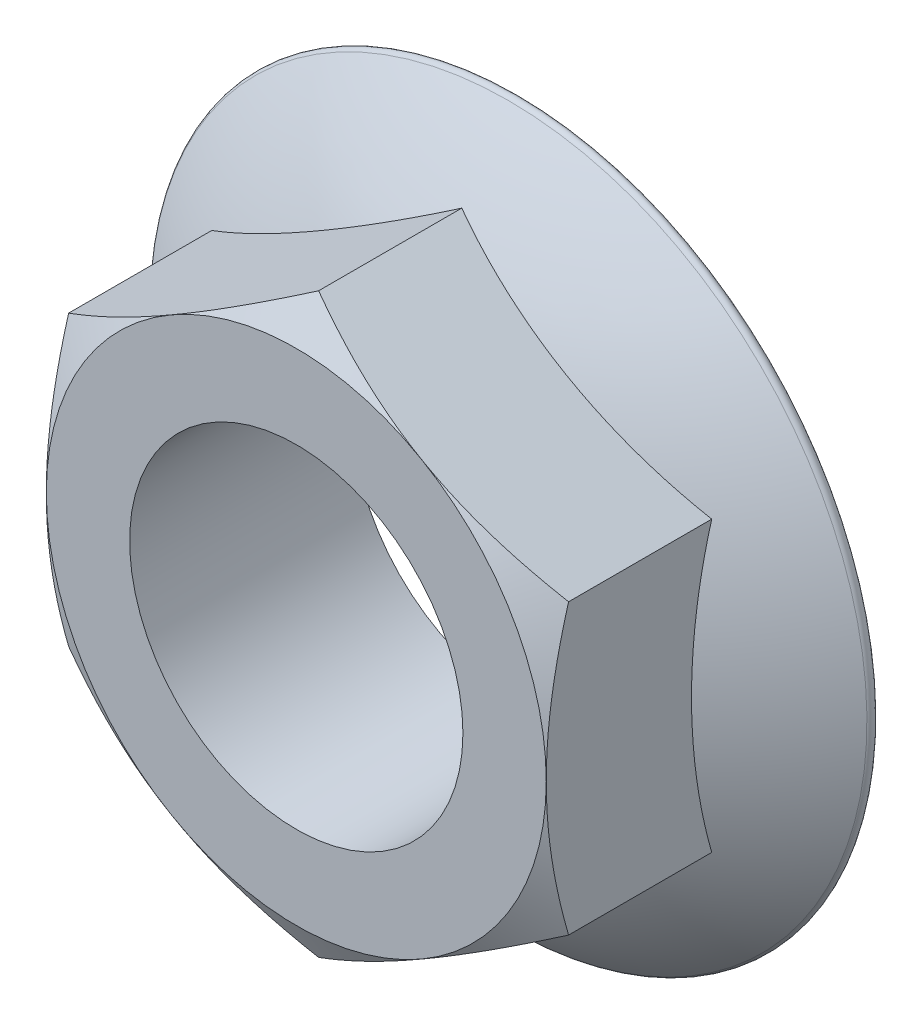
ISO-10303-21;
HEADER;
FILE_DESCRIPTION(('STEP AP214'),'2;1');
FILE_NAME('part.step','',(''),(''),'','','');
FILE_SCHEMA(('AUTOMOTIVE_DESIGN { 1 0 10303 214 1 1 1 1 }'));
ENDSEC;
DATA;
#1=APPLICATION_CONTEXT('core data for automotive mechanical design processes');
#2=APPLICATION_PROTOCOL_DEFINITION('international standard','automotive_design',2000,#1);
#3=PRODUCT_CONTEXT('',#1,'mechanical');
#4=PRODUCT('Part','Part','',(#3));
#5=PRODUCT_RELATED_PRODUCT_CATEGORY('part','',(#4));
#6=PRODUCT_DEFINITION_FORMATION('','',#4);
#7=PRODUCT_DEFINITION_CONTEXT('part definition',#1,'design');
#8=PRODUCT_DEFINITION('design','',#6,#7);
#9=PRODUCT_DEFINITION_SHAPE('','',#8);
#10=(LENGTH_UNIT() NAMED_UNIT(*) SI_UNIT(.MILLI.,.METRE.));
#11=(NAMED_UNIT(*) PLANE_ANGLE_UNIT() SI_UNIT($,.RADIAN.));
#12=(NAMED_UNIT(*) SI_UNIT($,.STERADIAN.) SOLID_ANGLE_UNIT());
#13=UNCERTAINTY_MEASURE_WITH_UNIT(LENGTH_MEASURE(1.E-05),#10,'distance_accuracy_value','');
#14=(GEOMETRIC_REPRESENTATION_CONTEXT(3) GLOBAL_UNCERTAINTY_ASSIGNED_CONTEXT((#13)) GLOBAL_UNIT_ASSIGNED_CONTEXT((#10,
#11,#12)) REPRESENTATION_CONTEXT('',''));
#15=CARTESIAN_POINT('',(0.,0.,0.));
#16=DIRECTION('',(0.,0.,1.));
#17=DIRECTION('',(1.,0.,0.));
#18=AXIS2_PLACEMENT_3D('',#15,#16,#17);
#19=CARTESIAN_POINT('',(0.,25.9807621135332,20.));
#20=DIRECTION('',(0.5,-0.866025403784439,0.));
#21=DIRECTION('',(0.866025403784439,0.5,0.));
#22=AXIS2_PLACEMENT_3D('',#19,#20,#21);
#23=PLANE('',#22);
#24=CARTESIAN_POINT('',(0.000199999999988087,25.980877583587,17.9903143896555));
#25=CARTESIAN_POINT('',(-0.494340315320369,25.6953545994117,18.1551492707593));
#26=CARTESIAN_POINT('',(-0.990809601239489,25.4087179235419,18.3125041584607));
#27=CARTESIAN_POINT('',(-1.98772926208787,24.8331460889906,18.6101747825265));
#28=CARTESIAN_POINT('',(-2.4881808890523,24.5442102074463,18.7504849147612));
#29=CARTESIAN_POINT('',(-3.49404310444018,23.9634753866245,19.0121827394149));
#30=CARTESIAN_POINT('',(-3.99946257540048,23.6716713190119,19.1335252438812));
#31=CARTESIAN_POINT('',(-5.01379199131475,23.0860479576868,19.3546738156916));
#32=CARTESIAN_POINT('',(-5.52270158333678,22.7922288677397,19.4544820284597));
#33=CARTESIAN_POINT('',(-6.53100308542398,22.2100857240854,19.6283253044473));
#34=CARTESIAN_POINT('',(-7.0303202045033,21.9218048509739,19.7029352669185));
#35=CARTESIAN_POINT('',(-8.03124235456726,21.3439221781966,19.8280391846674));
#36=CARTESIAN_POINT('',(-8.53284742940408,21.0543203532127,19.8785326757383));
#37=CARTESIAN_POINT('',(-9.53690018234173,20.4746302260236,19.954128715289));
#38=CARTESIAN_POINT('',(-10.0393461451645,20.1845429141346,19.9792614354897));
#39=CARTESIAN_POINT('',(-11.0447017408546,19.6041005903316,20.0035954599864));
#40=CARTESIAN_POINT('',(-11.5476113589139,19.313745586967,20.0027975655861));
#41=CARTESIAN_POINT('',(-12.4878094832121,18.7709219468119,19.9770814657185));
#42=CARTESIAN_POINT('',(-12.9251649504396,18.5184146500765,19.9552991118006));
#43=CARTESIAN_POINT('',(-13.7988317564138,18.0140028844653,19.892536574804));
#44=CARTESIAN_POINT('',(-14.2351431100254,17.7620984070071,19.8515566666916));
#45=CARTESIAN_POINT('',(-15.1065604849227,17.2589853510337,19.7511092481865));
#46=CARTESIAN_POINT('',(-15.5416650558499,17.0077776098832,19.6916250199366));
#47=CARTESIAN_POINT('',(-16.4097908378745,16.5065649559409,19.5552217340813));
#48=CARTESIAN_POINT('',(-16.842812057791,16.2565600380572,19.4783027503465));
#49=CARTESIAN_POINT('',(-18.1573722886485,15.4975983349057,19.2194196562896));
#50=CARTESIAN_POINT('',(-19.0351763947766,14.9907978979369,19.011627893702));
#51=CARTESIAN_POINT('',(-20.3421885092524,14.2361941018102,18.6578721503226));
#52=CARTESIAN_POINT('',(-20.7758690162324,13.985808544363,18.5330695175296));
#53=CARTESIAN_POINT('',(-21.6402303188989,13.4867693135914,18.2708295210671));
#54=CARTESIAN_POINT('',(-22.0709119234591,13.2381151732635,18.1333957185273));
#55=CARTESIAN_POINT('',(-22.5002,12.9902655867127,17.9903143896555));
#56=B_SPLINE_CURVE_WITH_KNOTS('',3,(#24,#25,#26,#27,#28,#29,#30,#31,#32,#33,#34,#35,#36,#37,#38,
#39,#40,#41,#42,#43,#44,#45,#46,#47,#48,#49,#50,#51,#52,#53,#54,#55),.UNSPECIFIED.,.F.,.F.,(4,2,
2,2,2,2,2,2,2,2,2,2,2,2,2,4),(0.,1.78312722203929,3.56683913913434,5.35473780165091,
7.14245825659312,8.88609109738608,10.6297574992032,12.3713470058018,14.1128826941264,
15.6289689473497,17.1450334863602,18.6624717220614,20.1799035285482,23.2816076138779,
24.8297579454588,26.377473135215),.UNSPECIFIED.);
#57=CARTESIAN_POINT('',(0.,25.9807621135332,17.9903810567666));
#58=VERTEX_POINT('',#57);
#59=CARTESIAN_POINT('',(-11.25,19.4855715851499,20.));
#60=VERTEX_POINT('',#59);
#61=EDGE_CURVE('E112',#58,#60,#56,.T.);
#62=ORIENTED_EDGE('',*,*,#61,.F.);
#63=DIRECTION('',(0.,0.,-1.));
#64=VECTOR('',#63,1.);
#65=CARTESIAN_POINT('',(0.,25.9807621135332,20.));
#66=LINE('',#65,#64);
#67=CARTESIAN_POINT('',(0.,25.9807621135332,5.10562126709525));
#68=VERTEX_POINT('',#67);
#69=EDGE_CURVE('E437',#58,#68,#66,.T.);
#70=ORIENTED_EDGE('',*,*,#69,.T.);
#71=CARTESIAN_POINT('',(-11.25,19.4855715851499,-40.4001136363637));
#72=DIRECTION('',(0.5,-0.866025403784439,0.));
#73=DIRECTION('',(0.866025403784439,0.5,0.));
#74=AXIS2_PLACEMENT_3D('',#71,#72,#73);
#75=CIRCLE('',#74,47.3235872383305);
#76=CARTESIAN_POINT('',(-22.5,12.9903810567666,5.10562126709524));
#77=VERTEX_POINT('',#76);
#78=EDGE_CURVE('E435',#77,#68,#75,.F.);
#79=ORIENTED_EDGE('',*,*,#78,.F.);
#80=DIRECTION('',(0.,0.,-1.));
#81=VECTOR('',#80,1.);
#82=CARTESIAN_POINT('',(-22.5,12.9903810567666,20.));
#83=LINE('',#82,#81);
#84=CARTESIAN_POINT('',(-22.5,12.9903810567666,17.9903810567666));
#85=VERTEX_POINT('',#84);
#86=EDGE_CURVE('E135',#85,#77,#83,.T.);
#87=ORIENTED_EDGE('',*,*,#86,.F.);
#88=EDGE_CURVE('E121',#60,#85,#56,.T.);
#89=ORIENTED_EDGE('',*,*,#88,.F.);
#90=EDGE_LOOP('',(#62,#70,#79,#87,#89));
#91=FACE_BOUND('',#90,.T.);
#92=ADVANCED_FACE('F42',(#91),#23,.F.);
#93=CARTESIAN_POINT('',(-22.5,12.9903810567666,20.));
#94=DIRECTION('',(1.,0.,0.));
#95=DIRECTION('',(0.,1.,0.));
#96=AXIS2_PLACEMENT_3D('',#93,#94,#95);
#97=PLANE('',#96);
#98=CARTESIAN_POINT('',(-22.5,42.937910116955,5.00279973211658));
#99=CARTESIAN_POINT('',(-22.5,42.4349867908762,5.25998830996277));
#100=CARTESIAN_POINT('',(-22.5,41.9316712448641,5.51640961946833));
#101=CARTESIAN_POINT('',(-22.5,40.9241808993457,6.02756274502809));
#102=CARTESIAN_POINT('',(-22.5,40.4200060968718,6.28229455523246));
#103=CARTESIAN_POINT('',(-22.5,38.906067399752,7.04372989587429));
#104=CARTESIAN_POINT('',(-22.5,37.8949075563431,7.54766394292194));
#105=CARTESIAN_POINT('',(-22.5,35.8664336922577,8.54744404798992));
#106=CARTESIAN_POINT('',(-22.5,34.849112085713,9.04327473279686));
#107=CARTESIAN_POINT('',(-22.5,32.8091562949487,10.0239453406089));
#108=CARTESIAN_POINT('',(-22.5,31.7865220333206,10.5087851029147));
#109=CARTESIAN_POINT('',(-22.5,29.6826836887022,11.489168716423));
#110=CARTESIAN_POINT('',(-22.5,28.6011475492797,11.9840015357758));
#111=CARTESIAN_POINT('',(-22.5,26.4295684611349,12.9545883452375));
#112=CARTESIAN_POINT('',(-22.5,25.3395259663007,13.4303433451106));
#113=CARTESIAN_POINT('',(-22.5,23.6970388665296,14.1254074700941));
#114=CARTESIAN_POINT('',(-22.5,23.1484886270678,14.3539282550564));
#115=CARTESIAN_POINT('',(-22.5,22.0485270558716,14.8039685587357));
#116=CARTESIAN_POINT('',(-22.5,21.4971157654287,15.0254881781701));
#117=CARTESIAN_POINT('',(-22.5,20.3909977243873,15.4606074265542));
#118=CARTESIAN_POINT('',(-22.5,19.8362901159973,15.6742048789127));
#119=CARTESIAN_POINT('',(-22.5,18.7234476974617,16.0922649956442));
#120=CARTESIAN_POINT('',(-22.5,18.1653129401696,16.2967278004915));
#121=CARTESIAN_POINT('',(-22.5,16.9449865841485,16.7309016542748));
#122=CARTESIAN_POINT('',(-22.5,16.2820662225517,16.9585738291773));
#123=CARTESIAN_POINT('',(-22.5,14.9505731173334,17.3968937659042));
#124=CARTESIAN_POINT('',(-22.5,14.2820001805723,17.6075409433931));
#125=CARTESIAN_POINT('',(-22.5,12.9391673365046,18.0088123953236));
#126=CARTESIAN_POINT('',(-22.5,12.2649101120209,18.1994456005083));
#127=CARTESIAN_POINT('',(-22.5,10.9102777489049,18.557528643239));
#128=CARTESIAN_POINT('',(-22.5,10.2299030383091,18.7249800895596));
#129=CARTESIAN_POINT('',(-22.5,8.87571641326102,19.0303528579027));
#130=CARTESIAN_POINT('',(-22.5,8.20201537871787,19.1687624656118));
#131=CARTESIAN_POINT('',(-22.5,6.84925952001052,19.4164959045111));
#132=CARTESIAN_POINT('',(-22.5,6.17020484117955,19.5258205224797));
#133=CARTESIAN_POINT('',(-22.5,4.8079571222068,19.7122164762278));
#134=CARTESIAN_POINT('',(-22.5,4.12476611922573,19.7893025566878));
#135=CARTESIAN_POINT('',(-22.5,2.75533096919536,19.9087926707029));
#136=CARTESIAN_POINT('',(-22.5,2.06908684258475,19.9511969360801));
#137=CARTESIAN_POINT('',(-22.5,0.687324246378,20.0001091636126));
#138=CARTESIAN_POINT('',(-22.5,-0.00820938704600008,20.0061945929854));
#139=CARTESIAN_POINT('',(-22.5,-1.39859832033207,19.9811125243047));
#140=CARTESIAN_POINT('',(-22.5,-2.09345361787947,19.9499448995746));
#141=CARTESIAN_POINT('',(-22.5,-3.48080015469796,19.8514850050863));
#142=CARTESIAN_POINT('',(-22.5,-4.1732905467787,19.7841809279115));
#143=CARTESIAN_POINT('',(-22.5,-5.55411755952298,19.6157455550602));
#144=CARTESIAN_POINT('',(-22.5,-6.24245408545504,19.5146134908613));
#145=CARTESIAN_POINT('',(-22.5,-7.62722706977454,19.2793387973371));
#146=CARTESIAN_POINT('',(-22.5,-8.32355984305465,19.1445910821305));
#147=CARTESIAN_POINT('',(-22.5,-9.71010675509671,18.846809177478));
#148=CARTESIAN_POINT('',(-22.5,-10.4003208338406,18.6837747108902));
#149=CARTESIAN_POINT('',(-22.5,-11.7745189775227,18.3330815856482));
#150=CARTESIAN_POINT('',(-22.5,-12.4585022055107,18.1454196696198));
#151=CARTESIAN_POINT('',(-22.5,-13.8202809477323,17.7489421717333));
#152=CARTESIAN_POINT('',(-22.5,-14.4980764221406,17.5401264538304));
#153=CARTESIAN_POINT('',(-22.5,-15.7921426442065,17.122402240074));
#154=CARTESIAN_POINT('',(-22.5,-16.408876911634,16.9149219806036));
#155=CARTESIAN_POINT('',(-22.5,-17.6377869149723,16.4868319747096));
#156=CARTESIAN_POINT('',(-22.5,-18.2499624656504,16.2662216980187));
#157=CARTESIAN_POINT('',(-22.5,-19.4702017344588,15.8136516015775));
#158=CARTESIAN_POINT('',(-22.5,-20.0782647898368,15.5816899998701));
#159=CARTESIAN_POINT('',(-22.5,-21.2905575041822,15.1079993142826));
#160=CARTESIAN_POINT('',(-22.5,-21.8947872099299,14.8662703498649));
#161=CARTESIAN_POINT('',(-22.5,-23.1003484017779,14.3741314470397));
#162=CARTESIAN_POINT('',(-22.5,-23.7016766801851,14.1237136653835));
#163=CARTESIAN_POINT('',(-22.5,-24.9012239962781,13.6155267116629));
#164=CARTESIAN_POINT('',(-22.5,-25.4994429898334,13.3577574355927));
#165=CARTESIAN_POINT('',(-22.5,-26.6930217519426,12.8358485601786));
#166=CARTESIAN_POINT('',(-22.5,-27.2883817976791,12.5717095939821));
#167=CARTESIAN_POINT('',(-22.5,-28.4765906338492,12.0378380893407));
#168=CARTESIAN_POINT('',(-22.5,-29.0694394044817,11.7681055068895));
#169=CARTESIAN_POINT('',(-22.5,-30.7817709336552,10.9804762057214));
#170=CARTESIAN_POINT('',(-22.5,-31.8983456673484,10.4562536555283));
#171=CARTESIAN_POINT('',(-22.5,-34.124920581488,9.39399908091056));
#172=CARTESIAN_POINT('',(-22.5,-35.2349205776655,8.8559666716726));
#173=CARTESIAN_POINT('',(-22.5,-37.4463300983147,7.77041638266379));
#174=CARTESIAN_POINT('',(-22.5,-38.5477551094307,7.22293001683051));
#175=CARTESIAN_POINT('',(-22.5,-40.1964930693805,6.39505102381711));
#176=CARTESIAN_POINT('',(-22.5,-40.745485226106,6.11799365715499));
#177=CARTESIAN_POINT('',(-22.5,-41.8424430578517,5.56186024348551));
#178=CARTESIAN_POINT('',(-22.5,-42.3904087376387,5.28278420588176));
#179=CARTESIAN_POINT('',(-22.5,-42.937910116955,5.00279973211657));
#180=B_SPLINE_CURVE_WITH_KNOTS('',3,(#98,#99,#100,#101,#102,#103,#104,#105,#106,#107,#108,#109,
#110,#111,#112,#113,#114,#115,#116,#117,#118,#119,#120,#121,#122,#123,#124,#125,#126,#127,#128,
#129,#130,#131,#132,#133,#134,#135,#136,#137,#138,#139,#140,#141,#142,#143,#144,#145,#146,#147,
#148,#149,#150,#151,#152,#153,#154,#155,#156,#157,#158,#159,#160,#161,#162,#163,#164,#165,#166,
#167,#168,#169,#170,#171,#172,#173,#174,#175,#176,#177,#178,#179),.UNSPECIFIED.,.F.,.F.,(4,2,2,
2,2,2,2,2,2,2,2,2,2,2,2,2,2,2,2,2,2,2,2,2,2,2,2,2,2,2,2,2,2,2,2,2,2,2,2,2,4),(0.,
1.69460800721613,3.38922187888549,6.77851144025747,10.1736205822667,13.5687793325238,
17.1367290228506,20.7044896163155,22.4871908668035,24.2698664600163,26.0530282634379,
27.83616263562,29.9387425585486,32.0413946160485,34.1431043928186,36.2446682413239,
38.307417211311,40.3701103761814,42.431859109237,44.4935940609252,46.579269162215,
48.6649513557284,50.7513154512245,52.8377269490867,54.9648116511539,57.0919171946992,
59.2193043660852,61.3467052200283,63.2986367527605,65.250647169518,67.2029650065895,
69.1552589725683,71.1093635950016,73.0634958770022,75.0174347123851,76.9713889257113,
80.6717851506886,84.3722845998144,88.0622051563254,89.9070267613382,91.7518397781164),.UNSPECIFIED.);
#181=CARTESIAN_POINT('',(-22.5,0.,20.));
#182=VERTEX_POINT('',#181);
#183=EDGE_CURVE('E127',#85,#182,#180,.T.);
#184=ORIENTED_EDGE('',*,*,#183,.F.);
#185=ORIENTED_EDGE('',*,*,#86,.T.);
#186=CARTESIAN_POINT('',(-22.5,0.,-40.4001136363637));
#187=DIRECTION('',(1.,0.,0.));
#188=DIRECTION('',(0.,1.,0.));
#189=AXIS2_PLACEMENT_3D('',#186,#187,#188);
#190=CIRCLE('',#189,47.3235872383305);
#191=CARTESIAN_POINT('',(-22.5,-12.9903810567666,5.10562126709524));
#192=VERTEX_POINT('',#191);
#193=EDGE_CURVE('E434',#192,#77,#190,.F.);
#194=ORIENTED_EDGE('',*,*,#193,.F.);
#195=DIRECTION('',(0.,0.,-1.));
#196=VECTOR('',#195,1.);
#197=CARTESIAN_POINT('',(-22.5,-12.9903810567666,20.));
#198=LINE('',#197,#196);
#199=CARTESIAN_POINT('',(-22.5,-12.9903810567666,17.9903810567666));
#200=VERTEX_POINT('',#199);
#201=EDGE_CURVE('E207',#200,#192,#198,.T.);
#202=ORIENTED_EDGE('',*,*,#201,.F.);
#203=EDGE_CURVE('E136',#182,#200,#180,.T.);
#204=ORIENTED_EDGE('',*,*,#203,.F.);
#205=EDGE_LOOP('',(#184,#185,#194,#202,#204));
#206=FACE_BOUND('',#205,.T.);
#207=ADVANCED_FACE('F196',(#206),#97,.F.);
#208=CARTESIAN_POINT('',(-22.5,-12.9903810567666,20.));
#209=DIRECTION('',(0.5,0.866025403784439,0.));
#210=DIRECTION('',(-0.866025403784439,0.5,0.));
#211=AXIS2_PLACEMENT_3D('',#208,#209,#210);
#212=PLANE('',#211);
#213=CARTESIAN_POINT('',(-22.5002,-12.9902655867127,17.9903143896555));
#214=CARTESIAN_POINT('',(-22.0056596846796,-13.2757885708881,18.1551492707593));
#215=CARTESIAN_POINT('',(-21.5091903987605,-13.5624252467579,18.3125041584607));
#216=CARTESIAN_POINT('',(-20.5122707379121,-14.1379970813091,18.6101747825265));
#217=CARTESIAN_POINT('',(-20.0118191109477,-14.4269329628534,18.7504849147612));
#218=CARTESIAN_POINT('',(-19.0059568955598,-15.0076677836753,19.0121827394149));
#219=CARTESIAN_POINT('',(-18.5005374245995,-15.2994718512879,19.1335252438812));
#220=CARTESIAN_POINT('',(-17.4862080086853,-15.8850952126129,19.3546738156916));
#221=CARTESIAN_POINT('',(-16.9772984166632,-16.17891430256,19.4544820284597));
#222=CARTESIAN_POINT('',(-15.968996914576,-16.7610574462144,19.6283253044473));
#223=CARTESIAN_POINT('',(-15.4696797954967,-17.0493383193258,19.7029352669185));
#224=CARTESIAN_POINT('',(-14.4687576454327,-17.6272209921031,19.8280391846674));
#225=CARTESIAN_POINT('',(-13.9671525705959,-17.916822817087,19.8785326757383));
#226=CARTESIAN_POINT('',(-12.9630998176583,-18.4965129442762,19.954128715289));
#227=CARTESIAN_POINT('',(-12.4606538548355,-18.7866002561651,19.9792614354897));
#228=CARTESIAN_POINT('',(-11.4552982591454,-19.3670425799681,20.0035954599864));
#229=CARTESIAN_POINT('',(-10.9523886410861,-19.6573975833327,20.0027975655861));
#230=CARTESIAN_POINT('',(-10.0121905167879,-20.2002212234878,19.9770814657185));
#231=CARTESIAN_POINT('',(-9.57483504956041,-20.4527285202232,19.9552991118006));
#232=CARTESIAN_POINT('',(-8.70116824358618,-20.9571402858345,19.892536574804));
#233=CARTESIAN_POINT('',(-8.26485688997456,-21.2090447632926,19.8515566666916));
#234=CARTESIAN_POINT('',(-7.39343951507735,-21.712157819266,19.7511092481865));
#235=CARTESIAN_POINT('',(-6.95833494415015,-21.9633655604165,19.6916250199366));
#236=CARTESIAN_POINT('',(-6.09020916212554,-22.4645782143588,19.5552217340813));
#237=CARTESIAN_POINT('',(-5.65718794220898,-22.7145831322425,19.4783027503465));
#238=CARTESIAN_POINT('',(-4.34262771135152,-23.473544835394,19.2194196562896));
#239=CARTESIAN_POINT('',(-3.46482360522342,-23.9803452723628,19.011627893702));
#240=CARTESIAN_POINT('',(-2.15781149074759,-24.7349490684896,18.6578721503226));
#241=CARTESIAN_POINT('',(-1.72413098376759,-24.9853346259368,18.5330695175296));
#242=CARTESIAN_POINT('',(-0.859769681101058,-25.4843738567084,18.2708295210671));
#243=CARTESIAN_POINT('',(-0.429088076540872,-25.7330279970362,18.1333957185273));
#244=CARTESIAN_POINT('',(0.000200000000008003,-25.980877583587,17.9903143896555));
#245=B_SPLINE_CURVE_WITH_KNOTS('',3,(#213,#214,#215,#216,#217,#218,#219,#220,#221,#222,#223,
#224,#225,#226,#227,#228,#229,#230,#231,#232,#233,#234,#235,#236,#237,#238,#239,#240,#241,#242,
#243,#244),.UNSPECIFIED.,.F.,.F.,(4,2,2,2,2,2,2,2,2,2,2,2,2,2,2,4),(0.,1.78312722203929,
3.56683913913434,5.35473780165091,7.14245825659312,8.88609109738608,10.6297574992032,
12.3713470058018,14.1128826941264,15.6289689473497,17.1450334863602,18.6624717220614,
20.1799035285482,23.281607613878,24.8297579454588,26.3774731352151),.UNSPECIFIED.);
#246=CARTESIAN_POINT('',(-11.25,-19.4855715851499,20.));
#247=VERTEX_POINT('',#246);
#248=EDGE_CURVE('E190',#200,#247,#245,.T.);
#249=ORIENTED_EDGE('',*,*,#248,.F.);
#250=ORIENTED_EDGE('',*,*,#201,.T.);
#251=CARTESIAN_POINT('',(-11.25,-19.4855715851499,-40.4001136363637));
#252=DIRECTION('',(0.5,0.866025403784439,0.));
#253=DIRECTION('',(-0.866025403784439,0.5,0.));
#254=AXIS2_PLACEMENT_3D('',#251,#252,#253);
#255=CIRCLE('',#254,47.3235872383305);
#256=CARTESIAN_POINT('',(0.,-25.9807621135332,5.10562126709524));
#257=VERTEX_POINT('',#256);
#258=EDGE_CURVE('E224',#257,#192,#255,.F.);
#259=ORIENTED_EDGE('',*,*,#258,.F.);
#260=DIRECTION('',(0.,0.,-1.));
#261=VECTOR('',#260,1.);
#262=CARTESIAN_POINT('',(0.,-25.9807621135332,20.));
#263=LINE('',#262,#261);
#264=CARTESIAN_POINT('',(0.,-25.9807621135332,17.9903810567666));
#265=VERTEX_POINT('',#264);
#266=EDGE_CURVE('E222',#265,#257,#263,.T.);
#267=ORIENTED_EDGE('',*,*,#266,.F.);
#268=EDGE_CURVE('E184',#247,#265,#245,.T.);
#269=ORIENTED_EDGE('',*,*,#268,.F.);
#270=EDGE_LOOP('',(#249,#250,#259,#267,#269));
#271=FACE_BOUND('',#270,.T.);
#272=ADVANCED_FACE('F192',(#271),#212,.F.);
#273=CARTESIAN_POINT('',(0.,-25.9807621135332,20.));
#274=DIRECTION('',(-0.5,0.866025403784439,0.));
#275=DIRECTION('',(-0.866025403784439,-0.5,0.));
#276=AXIS2_PLACEMENT_3D('',#273,#274,#275);
#277=PLANE('',#276);
#278=CARTESIAN_POINT('',(-0.000199999999989221,-25.980877583587,17.9903143896555));
#279=CARTESIAN_POINT('',(0.494340315320367,-25.6953545994117,18.1551492707593));
#280=CARTESIAN_POINT('',(0.990809601239487,-25.4087179235419,18.3125041584607));
#281=CARTESIAN_POINT('',(1.98772926208787,-24.8331460889906,18.6101747825265));
#282=CARTESIAN_POINT('',(2.4881808890523,-24.5442102074463,18.7504849147612));
#283=CARTESIAN_POINT('',(3.49404310444018,-23.9634753866245,19.0121827394149));
#284=CARTESIAN_POINT('',(3.99946257540048,-23.6716713190119,19.1335252438812));
#285=CARTESIAN_POINT('',(5.01379199131475,-23.0860479576868,19.3546738156916));
#286=CARTESIAN_POINT('',(5.52270158333678,-22.7922288677397,19.4544820284597));
#287=CARTESIAN_POINT('',(6.53100308542397,-22.2100857240854,19.6283253044473));
#288=CARTESIAN_POINT('',(7.0303202045033,-21.9218048509739,19.7029352669185));
#289=CARTESIAN_POINT('',(8.03124235456725,-21.3439221781966,19.8280391846674));
#290=CARTESIAN_POINT('',(8.53284742940407,-21.0543203532127,19.8785326757383));
#291=CARTESIAN_POINT('',(9.53690018234173,-20.4746302260236,19.954128715289));
#292=CARTESIAN_POINT('',(10.0393461451645,-20.1845429141346,19.9792614354897));
#293=CARTESIAN_POINT('',(11.0447017408546,-19.6041005903316,20.0035954599864));
#294=CARTESIAN_POINT('',(11.5476113589139,-19.313745586967,20.0027975655861));
#295=CARTESIAN_POINT('',(12.4878094832121,-18.7709219468119,19.9770814657185));
#296=CARTESIAN_POINT('',(12.9251649504396,-18.5184146500765,19.9552991118006));
#297=CARTESIAN_POINT('',(13.7988317564138,-18.0140028844653,19.892536574804));
#298=CARTESIAN_POINT('',(14.2351431100254,-17.7620984070071,19.8515566666916));
#299=CARTESIAN_POINT('',(15.1065604849227,-17.2589853510337,19.7511092481865));
#300=CARTESIAN_POINT('',(15.5416650558499,-17.0077776098832,19.6916250199366));
#301=CARTESIAN_POINT('',(16.4097908378745,-16.5065649559409,19.5552217340813));
#302=CARTESIAN_POINT('',(16.842812057791,-16.2565600380572,19.4783027503465));
#303=CARTESIAN_POINT('',(18.1573722886485,-15.4975983349057,19.2194196562896));
#304=CARTESIAN_POINT('',(19.0351763947766,-14.9907978979369,19.011627893702));
#305=CARTESIAN_POINT('',(20.3421885092524,-14.2361941018102,18.6578721503226));
#306=CARTESIAN_POINT('',(20.7758690162324,-13.985808544363,18.5330695175296));
#307=CARTESIAN_POINT('',(21.6402303188989,-13.4867693135914,18.2708295210671));
#308=CARTESIAN_POINT('',(22.0709119234591,-13.2381151732635,18.1333957185273));
#309=CARTESIAN_POINT('',(22.5002,-12.9902655867127,17.9903143896555));
#310=B_SPLINE_CURVE_WITH_KNOTS('',3,(#278,#279,#280,#281,#282,#283,#284,#285,#286,#287,#288,
#289,#290,#291,#292,#293,#294,#295,#296,#297,#298,#299,#300,#301,#302,#303,#304,#305,#306,#307,
#308,#309),.UNSPECIFIED.,.F.,.F.,(4,2,2,2,2,2,2,2,2,2,2,2,2,2,2,4),(0.,1.78312722203929,
3.56683913913434,5.35473780165091,7.14245825659312,8.88609109738608,10.6297574992032,
12.3713470058018,14.1128826941264,15.6289689473497,17.1450334863602,18.6624717220614,
20.1799035285482,23.281607613878,24.8297579454588,26.3774731352151),.UNSPECIFIED.);
#311=CARTESIAN_POINT('',(11.25,-19.4855715851499,20.));
#312=VERTEX_POINT('',#311);
#313=EDGE_CURVE('E191',#265,#312,#310,.T.);
#314=ORIENTED_EDGE('',*,*,#313,.F.);
#315=ORIENTED_EDGE('',*,*,#266,.T.);
#316=CARTESIAN_POINT('',(11.25,-19.4855715851499,-40.4001136363637));
#317=DIRECTION('',(-0.5,0.866025403784439,0.));
#318=DIRECTION('',(-0.866025403784439,-0.5,0.));
#319=AXIS2_PLACEMENT_3D('',#316,#317,#318);
#320=CIRCLE('',#319,47.3235872383305);
#321=CARTESIAN_POINT('',(22.5,-12.9903810567666,5.10562126709524));
#322=VERTEX_POINT('',#321);
#323=EDGE_CURVE('E439',#322,#257,#320,.F.);
#324=ORIENTED_EDGE('',*,*,#323,.F.);
#325=DIRECTION('',(0.,0.,-1.));
#326=VECTOR('',#325,1.);
#327=CARTESIAN_POINT('',(22.5,-12.9903810567666,20.));
#328=LINE('',#327,#326);
#329=CARTESIAN_POINT('',(22.5,-12.9903810567666,17.9903810567666));
#330=VERTEX_POINT('',#329);
#331=EDGE_CURVE('E228',#330,#322,#328,.T.);
#332=ORIENTED_EDGE('',*,*,#331,.F.);
#333=EDGE_CURVE('E178',#312,#330,#310,.T.);
#334=ORIENTED_EDGE('',*,*,#333,.F.);
#335=EDGE_LOOP('',(#314,#315,#324,#332,#334));
#336=FACE_BOUND('',#335,.T.);
#337=ADVANCED_FACE('F195',(#336),#277,.F.);
#338=CARTESIAN_POINT('',(22.5,-12.9903810567666,20.));
#339=DIRECTION('',(-1.,0.,0.));
#340=DIRECTION('',(0.,-1.,0.));
#341=AXIS2_PLACEMENT_3D('',#338,#339,#340);
#342=PLANE('',#341);
#343=CARTESIAN_POINT('',(22.5,-42.937910116955,5.00279973211658));
#344=CARTESIAN_POINT('',(22.5,-42.4349867908762,5.25998830996278));
#345=CARTESIAN_POINT('',(22.5,-41.9316712448641,5.51640961946833));
#346=CARTESIAN_POINT('',(22.5,-40.9241808993457,6.02756274502809));
#347=CARTESIAN_POINT('',(22.5,-40.4200060968718,6.28229455523247));
#348=CARTESIAN_POINT('',(22.5,-38.906067399752,7.0437298958743));
#349=CARTESIAN_POINT('',(22.5,-37.8949075563431,7.54766394292195));
#350=CARTESIAN_POINT('',(22.5,-35.8664336922576,8.54744404798993));
#351=CARTESIAN_POINT('',(22.5,-34.849112085713,9.04327473279687));
#352=CARTESIAN_POINT('',(22.5,-32.8091562949487,10.0239453406089));
#353=CARTESIAN_POINT('',(22.5,-31.7865220333206,10.5087851029147));
#354=CARTESIAN_POINT('',(22.5,-29.6826836887022,11.489168716423));
#355=CARTESIAN_POINT('',(22.5,-28.6011475492797,11.9840015357758));
#356=CARTESIAN_POINT('',(22.5,-26.4295684611348,12.9545883452375));
#357=CARTESIAN_POINT('',(22.5,-25.3395259663006,13.4303433451107));
#358=CARTESIAN_POINT('',(22.5,-23.6970388665296,14.1254074700941));
#359=CARTESIAN_POINT('',(22.5,-23.1484886270677,14.3539282550564));
#360=CARTESIAN_POINT('',(22.5,-22.0485270558715,14.8039685587357));
#361=CARTESIAN_POINT('',(22.5,-21.4971157654287,15.0254881781701));
#362=CARTESIAN_POINT('',(22.5,-20.3909977243873,15.4606074265542));
#363=CARTESIAN_POINT('',(22.5,-19.8362901159973,15.6742048789127));
#364=CARTESIAN_POINT('',(22.5,-18.7234476974617,16.0922649956442));
#365=CARTESIAN_POINT('',(22.5,-18.1653129401696,16.2967278004915));
#366=CARTESIAN_POINT('',(22.5,-16.9449865841485,16.7309016542748));
#367=CARTESIAN_POINT('',(22.5,-16.2820662225517,16.9585738291773));
#368=CARTESIAN_POINT('',(22.5,-14.9505731173334,17.3968937659042));
#369=CARTESIAN_POINT('',(22.5,-14.2820001805723,17.6075409433931));
#370=CARTESIAN_POINT('',(22.5,-12.9391673365046,18.0088123953236));
#371=CARTESIAN_POINT('',(22.5,-12.2649101120208,18.1994456005083));
#372=CARTESIAN_POINT('',(22.5,-10.9102777489049,18.557528643239));
#373=CARTESIAN_POINT('',(22.5,-10.2299030383091,18.7249800895596));
#374=CARTESIAN_POINT('',(22.5,-8.875716413261,19.0303528579027));
#375=CARTESIAN_POINT('',(22.5,-8.20201537871785,19.1687624656118));
#376=CARTESIAN_POINT('',(22.5,-6.8492595200105,19.4164959045111));
#377=CARTESIAN_POINT('',(22.5,-6.17020484117954,19.5258205224797));
#378=CARTESIAN_POINT('',(22.5,-4.80795712220679,19.7122164762278));
#379=CARTESIAN_POINT('',(22.5,-4.12476611922571,19.7893025566878));
#380=CARTESIAN_POINT('',(22.5,-2.75533096919534,19.9087926707029));
#381=CARTESIAN_POINT('',(22.5,-2.06908684258473,19.9511969360801));
#382=CARTESIAN_POINT('',(22.5,-0.687324246377983,20.0001091636126));
#383=CARTESIAN_POINT('',(22.5,0.008209387046017,20.0061945929854));
#384=CARTESIAN_POINT('',(22.5,1.39859832033209,19.9811125243047));
#385=CARTESIAN_POINT('',(22.5,2.09345361787948,19.9499448995746));
#386=CARTESIAN_POINT('',(22.5,3.48080015469797,19.8514850050863));
#387=CARTESIAN_POINT('',(22.5,4.17329054677871,19.7841809279115));
#388=CARTESIAN_POINT('',(22.5,5.55411755952299,19.6157455550602));
#389=CARTESIAN_POINT('',(22.5,6.24245408545505,19.5146134908613));
#390=CARTESIAN_POINT('',(22.5,7.62722706977456,19.2793387973371));
#391=CARTESIAN_POINT('',(22.5,8.32355984305466,19.1445910821305));
#392=CARTESIAN_POINT('',(22.5,9.71010675509672,18.846809177478));
#393=CARTESIAN_POINT('',(22.5,10.4003208338406,18.6837747108902));
#394=CARTESIAN_POINT('',(22.5,11.7745189775227,18.3330815856482));
#395=CARTESIAN_POINT('',(22.5,12.4585022055107,18.1454196696198));
#396=CARTESIAN_POINT('',(22.5,13.8202809477323,17.7489421717333));
#397=CARTESIAN_POINT('',(22.5,14.4980764221406,17.5401264538304));
#398=CARTESIAN_POINT('',(22.5,15.7921426442065,17.122402240074));
#399=CARTESIAN_POINT('',(22.5,16.408876911634,16.9149219806036));
#400=CARTESIAN_POINT('',(22.5,17.6377869149723,16.4868319747096));
#401=CARTESIAN_POINT('',(22.5,18.2499624656504,16.2662216980187));
#402=CARTESIAN_POINT('',(22.5,19.4702017344588,15.8136516015775));
#403=CARTESIAN_POINT('',(22.5,20.0782647898368,15.5816899998701));
#404=CARTESIAN_POINT('',(22.5,21.2905575041822,15.1079993142826));
#405=CARTESIAN_POINT('',(22.5,21.8947872099299,14.8662703498649));
#406=CARTESIAN_POINT('',(22.5,23.1003484017779,14.3741314470397));
#407=CARTESIAN_POINT('',(22.5,23.7016766801851,14.1237136653835));
#408=CARTESIAN_POINT('',(22.5,24.9012239962781,13.6155267116629));
#409=CARTESIAN_POINT('',(22.5,25.4994429898334,13.3577574355927));
#410=CARTESIAN_POINT('',(22.5,26.6930217519426,12.8358485601786));
#411=CARTESIAN_POINT('',(22.5,27.2883817976791,12.5717095939821));
#412=CARTESIAN_POINT('',(22.5,28.4765906338492,12.0378380893407));
#413=CARTESIAN_POINT('',(22.5,29.0694394044817,11.7681055068895));
#414=CARTESIAN_POINT('',(22.5,30.7817709336552,10.9804762057214));
#415=CARTESIAN_POINT('',(22.5,31.8983456673484,10.4562536555283));
#416=CARTESIAN_POINT('',(22.5,34.124920581488,9.39399908091057));
#417=CARTESIAN_POINT('',(22.5,35.2349205776655,8.8559666716726));
#418=CARTESIAN_POINT('',(22.5,37.4463300983147,7.7704163826638));
#419=CARTESIAN_POINT('',(22.5,38.5477551094307,7.22293001683053));
#420=CARTESIAN_POINT('',(22.5,40.1964930693805,6.39505102381713));
#421=CARTESIAN_POINT('',(22.5,40.745485226106,6.11799365715501));
#422=CARTESIAN_POINT('',(22.5,41.8424430578517,5.56186024348553));
#423=CARTESIAN_POINT('',(22.5,42.3904087376386,5.28278420588178));
#424=CARTESIAN_POINT('',(22.5,42.937910116955,5.00279973211659));
#425=B_SPLINE_CURVE_WITH_KNOTS('',3,(#343,#344,#345,#346,#347,#348,#349,#350,#351,#352,#353,
#354,#355,#356,#357,#358,#359,#360,#361,#362,#363,#364,#365,#366,#367,#368,#369,#370,#371,#372,
#373,#374,#375,#376,#377,#378,#379,#380,#381,#382,#383,#384,#385,#386,#387,#388,#389,#390,#391,
#392,#393,#394,#395,#396,#397,#398,#399,#400,#401,#402,#403,#404,#405,#406,#407,#408,#409,#410,
#411,#412,#413,#414,#415,#416,#417,#418,#419,#420,#421,#422,#423,#424),.UNSPECIFIED.,.F.,.F.,(4,
2,2,2,2,2,2,2,2,2,2,2,2,2,2,2,2,2,2,2,2,2,2,2,2,2,2,2,2,2,2,2,2,2,2,2,2,2,2,2,4),(0.,
1.69460800721612,3.38922187888548,6.77851144025747,10.1736205822667,13.5687793325238,
17.1367290228506,20.7044896163155,22.4871908668035,24.2698664600163,26.0530282634379,
27.83616263562,29.9387425585486,32.0413946160485,34.1431043928186,36.2446682413239,
38.307417211311,40.3701103761814,42.431859109237,44.4935940609252,46.579269162215,
48.6649513557284,50.7513154512245,52.8377269490867,54.9648116511539,57.0919171946992,
59.2193043660852,61.3467052200283,63.2986367527604,65.2506471695179,67.2029650065895,
69.1552589725683,71.1093635950016,73.0634958770021,75.0174347123851,76.9713889257112,
80.6717851506885,84.3722845998143,88.0622051563253,89.9070267613381,91.7518397781163),.UNSPECIFIED.);
#426=CARTESIAN_POINT('',(22.5,0.,20.));
#427=VERTEX_POINT('',#426);
#428=EDGE_CURVE('E247',#330,#427,#425,.T.);
#429=ORIENTED_EDGE('',*,*,#428,.F.);
#430=ORIENTED_EDGE('',*,*,#331,.T.);
#431=CARTESIAN_POINT('',(22.5,0.,-40.4001136363637));
#432=DIRECTION('',(-1.,0.,0.));
#433=DIRECTION('',(0.,-1.,0.));
#434=AXIS2_PLACEMENT_3D('',#431,#432,#433);
#435=CIRCLE('',#434,47.3235872383305);
#436=CARTESIAN_POINT('',(22.5,12.9903810567666,5.10562126709525));
#437=VERTEX_POINT('',#436);
#438=EDGE_CURVE('E443',#437,#322,#435,.F.);
#439=ORIENTED_EDGE('',*,*,#438,.F.);
#440=DIRECTION('',(0.,0.,-1.));
#441=VECTOR('',#440,1.);
#442=CARTESIAN_POINT('',(22.5,12.9903810567666,20.));
#443=LINE('',#442,#441);
#444=CARTESIAN_POINT('',(22.5,12.9903810567666,17.9903810567666));
#445=VERTEX_POINT('',#444);
#446=EDGE_CURVE('E231',#445,#437,#443,.T.);
#447=ORIENTED_EDGE('',*,*,#446,.F.);
#448=EDGE_CURVE('E171',#427,#445,#425,.T.);
#449=ORIENTED_EDGE('',*,*,#448,.F.);
#450=EDGE_LOOP('',(#429,#430,#439,#447,#449));
#451=FACE_BOUND('',#450,.T.);
#452=ADVANCED_FACE('F246',(#451),#342,.F.);
#453=CARTESIAN_POINT('',(22.5,12.9903810567666,20.));
#454=DIRECTION('',(-0.5,-0.866025403784439,0.));
#455=DIRECTION('',(0.866025403784439,-0.5,0.));
#456=AXIS2_PLACEMENT_3D('',#453,#454,#455);
#457=PLANE('',#456);
#458=CARTESIAN_POINT('',(22.5002,12.9902655867127,17.9903143896555));
#459=CARTESIAN_POINT('',(22.0056596846796,13.2757885708881,18.1551492707593));
#460=CARTESIAN_POINT('',(21.5091903987605,13.5624252467579,18.3125041584607));
#461=CARTESIAN_POINT('',(20.5122707379121,14.1379970813091,18.6101747825265));
#462=CARTESIAN_POINT('',(20.0118191109477,14.4269329628534,18.7504849147612));
#463=CARTESIAN_POINT('',(19.0059568955598,15.0076677836753,19.0121827394149));
#464=CARTESIAN_POINT('',(18.5005374245995,15.2994718512879,19.1335252438812));
#465=CARTESIAN_POINT('',(17.4862080086853,15.8850952126129,19.3546738156916));
#466=CARTESIAN_POINT('',(16.9772984166632,16.17891430256,19.4544820284597));
#467=CARTESIAN_POINT('',(15.968996914576,16.7610574462144,19.6283253044473));
#468=CARTESIAN_POINT('',(15.4696797954967,17.0493383193258,19.7029352669185));
#469=CARTESIAN_POINT('',(14.4687576454328,17.6272209921031,19.8280391846674));
#470=CARTESIAN_POINT('',(13.9671525705959,17.916822817087,19.8785326757383));
#471=CARTESIAN_POINT('',(12.9630998176583,18.4965129442762,19.954128715289));
#472=CARTESIAN_POINT('',(12.4606538548355,18.7866002561651,19.9792614354897));
#473=CARTESIAN_POINT('',(11.4552982591454,19.3670425799681,20.0035954599864));
#474=CARTESIAN_POINT('',(10.9523886410861,19.6573975833327,20.0027975655861));
#475=CARTESIAN_POINT('',(10.0121905167879,20.2002212234878,19.9770814657185));
#476=CARTESIAN_POINT('',(9.57483504956042,20.4527285202232,19.9552991118006));
#477=CARTESIAN_POINT('',(8.70116824358618,20.9571402858344,19.892536574804));
#478=CARTESIAN_POINT('',(8.26485688997456,21.2090447632926,19.8515566666916));
#479=CARTESIAN_POINT('',(7.39343951507735,21.712157819266,19.7511092481865));
#480=CARTESIAN_POINT('',(6.95833494415015,21.9633655604165,19.6916250199366));
#481=CARTESIAN_POINT('',(6.09020916212554,22.4645782143588,19.5552217340813));
#482=CARTESIAN_POINT('',(5.65718794220898,22.7145831322425,19.4783027503465));
#483=CARTESIAN_POINT('',(4.34262771135151,23.473544835394,19.2194196562896));
#484=CARTESIAN_POINT('',(3.46482360522342,23.9803452723628,19.011627893702));
#485=CARTESIAN_POINT('',(2.15781149074758,24.7349490684896,18.6578721503226));
#486=CARTESIAN_POINT('',(1.72413098376758,24.9853346259368,18.5330695175296));
#487=CARTESIAN_POINT('',(0.859769681101055,25.4843738567084,18.2708295210671));
#488=CARTESIAN_POINT('',(0.429088076540869,25.7330279970362,18.1333957185273));
#489=CARTESIAN_POINT('',(-0.000200000000013299,25.980877583587,17.9903143896555));
#490=B_SPLINE_CURVE_WITH_KNOTS('',3,(#458,#459,#460,#461,#462,#463,#464,#465,#466,#467,#468,
#469,#470,#471,#472,#473,#474,#475,#476,#477,#478,#479,#480,#481,#482,#483,#484,#485,#486,#487,
#488,#489),.UNSPECIFIED.,.F.,.F.,(4,2,2,2,2,2,2,2,2,2,2,2,2,2,2,4),(0.,1.78312722203929,
3.56683913913433,5.35473780165091,7.14245825659312,8.88609109738608,10.6297574992032,
12.3713470058018,14.1128826941264,15.6289689473497,17.1450334863602,18.6624717220614,
20.1799035285482,23.281607613878,24.8297579454588,26.3774731352151),.UNSPECIFIED.);
#491=CARTESIAN_POINT('',(11.25,19.4855715851499,20.));
#492=VERTEX_POINT('',#491);
#493=EDGE_CURVE('E251',#445,#492,#490,.T.);
#494=ORIENTED_EDGE('',*,*,#493,.F.);
#495=ORIENTED_EDGE('',*,*,#446,.T.);
#496=CARTESIAN_POINT('',(11.25,19.4855715851499,-40.4001136363637));
#497=DIRECTION('',(-0.5,-0.866025403784439,0.));
#498=DIRECTION('',(0.866025403784439,-0.5,0.));
#499=AXIS2_PLACEMENT_3D('',#496,#497,#498);
#500=CIRCLE('',#499,47.3235872383305);
#501=EDGE_CURVE('E235',#68,#437,#500,.F.);
#502=ORIENTED_EDGE('',*,*,#501,.F.);
#503=ORIENTED_EDGE('',*,*,#69,.F.);
#504=EDGE_CURVE('E116',#492,#58,#490,.T.);
#505=ORIENTED_EDGE('',*,*,#504,.F.);
#506=EDGE_LOOP('',(#494,#495,#502,#503,#505));
#507=FACE_BOUND('',#506,.T.);
#508=ADVANCED_FACE('F274',(#507),#457,.F.);
#509=CARTESIAN_POINT('',(0.,0.,-40.4001136363637));
#510=DIRECTION('',(0.,0.,-1.));
#511=DIRECTION('',(0.,1.,0.));
#512=AXIS2_PLACEMENT_3D('',#509,#510,#511);
#513=SPHERICAL_SURFACE('',#512,52.4001136363642);
#514=CARTESIAN_POINT('',(0.,0.,0.89402720698235));
#515=DIRECTION('',(0.,0.,-1.));
#516=DIRECTION('',(0.,1.,0.));
#517=AXIS2_PLACEMENT_3D('',#514,#515,#516);
#518=CIRCLE('',#517,32.2578027942664);
#519=CARTESIAN_POINT('',(0.,32.2578027942664,0.894027206982354));
#520=VERTEX_POINT('',#519);
#521=EDGE_CURVE('E432',#520,#520,#518,.T.);
#522=ORIENTED_EDGE('',*,*,#521,.F.);
#523=EDGE_LOOP('',(#522));
#524=FACE_BOUND('',#523,.T.);
#525=ORIENTED_EDGE('',*,*,#193,.T.);
#526=ORIENTED_EDGE('',*,*,#78,.T.);
#527=ORIENTED_EDGE('',*,*,#501,.T.);
#528=ORIENTED_EDGE('',*,*,#438,.T.);
#529=ORIENTED_EDGE('',*,*,#323,.T.);
#530=ORIENTED_EDGE('',*,*,#258,.T.);
#531=EDGE_LOOP('',(#525,#526,#527,#528,#529,#530));
#532=FACE_BOUND('',#531,.T.);
#533=ADVANCED_FACE('F270',(#524,#532),#513,.T.);
#534=CARTESIAN_POINT('',(0.,0.,0.500000000000004));
#535=DIRECTION('',(0.,0.,-1.));
#536=DIRECTION('',(0.,1.,0.));
#537=AXIS2_PLACEMENT_3D('',#534,#535,#536);
#538=TOROIDAL_SURFACE('',#537,31.95,0.500000000000508);
#539=CARTESIAN_POINT('',(0.,0.,-5.03927551068935E-13));
#540=DIRECTION('',(0.,0.,-1.));
#541=DIRECTION('',(0.,1.,0.));
#542=AXIS2_PLACEMENT_3D('',#539,#540,#541);
#543=CIRCLE('',#542,31.95);
#544=CARTESIAN_POINT('',(0.,31.95,-5.00014804545659E-13));
#545=VERTEX_POINT('',#544);
#546=EDGE_CURVE('E120',#545,#545,#543,.T.);
#547=ORIENTED_EDGE('',*,*,#546,.F.);
#548=EDGE_LOOP('',(#547));
#549=FACE_BOUND('',#548,.T.);
#550=ORIENTED_EDGE('',*,*,#521,.T.);
#551=EDGE_LOOP('',(#550));
#552=FACE_BOUND('',#551,.T.);
#553=ADVANCED_FACE('F156',(#549,#552),#538,.T.);
#554=CARTESIAN_POINT('',(0.,0.,0.));
#555=DIRECTION('',(0.,0.,1.));
#556=DIRECTION('',(1.,0.,0.));
#557=AXIS2_PLACEMENT_3D('',#554,#555,#556);
#558=PLANE('',#557);
#559=CARTESIAN_POINT('',(0.,0.,-4.9960036108132E-13));
#560=DIRECTION('',(0.,0.,1.));
#561=DIRECTION('',(1.,0.,0.));
#562=AXIS2_PLACEMENT_3D('',#559,#560,#561);
#563=CIRCLE('',#562,15.);
#564=CARTESIAN_POINT('',(15.,0.,-4.9960036108132E-13));
#565=VERTEX_POINT('',#564);
#566=EDGE_CURVE('E252',#565,#565,#563,.T.);
#567=ORIENTED_EDGE('',*,*,#566,.T.);
#568=EDGE_LOOP('',(#567));
#569=FACE_BOUND('',#568,.T.);
#570=ORIENTED_EDGE('',*,*,#546,.T.);
#571=EDGE_LOOP('',(#570));
#572=FACE_BOUND('',#571,.T.);
#573=ADVANCED_FACE('F271',(#569,#572),#558,.F.);
#574=CARTESIAN_POINT('',(0.,0.,20.));
#575=DIRECTION('',(0.,0.,-1.));
#576=DIRECTION('',(1.,0.,0.));
#577=AXIS2_PLACEMENT_3D('',#574,#575,#576);
#578=CONICAL_SURFACE('',#577,22.5,1.0471975511966);
#579=ORIENTED_EDGE('',*,*,#333,.T.);
#580=ORIENTED_EDGE('',*,*,#428,.T.);
#581=CARTESIAN_POINT('',(0.,0.,20.));
#582=DIRECTION('',(0.,0.,1.));
#583=DIRECTION('',(1.,0.,0.));
#584=AXIS2_PLACEMENT_3D('',#581,#582,#583);
#585=CIRCLE('',#584,22.5);
#586=EDGE_CURVE('E46',#312,#427,#585,.T.);
#587=ORIENTED_EDGE('',*,*,#586,.F.);
#588=EDGE_LOOP('',(#579,#580,#587));
#589=FACE_BOUND('',#588,.T.);
#590=ADVANCED_FACE('F268',(#589),#578,.T.);
#591=ORIENTED_EDGE('',*,*,#268,.T.);
#592=ORIENTED_EDGE('',*,*,#313,.T.);
#593=EDGE_CURVE('E215',#247,#312,#585,.T.);
#594=ORIENTED_EDGE('',*,*,#593,.F.);
#595=EDGE_LOOP('',(#591,#592,#594));
#596=FACE_BOUND('',#595,.T.);
#597=ADVANCED_FACE('F216',(#596),#578,.T.);
#598=ORIENTED_EDGE('',*,*,#203,.T.);
#599=ORIENTED_EDGE('',*,*,#248,.T.);
#600=EDGE_CURVE('E131',#182,#247,#585,.T.);
#601=ORIENTED_EDGE('',*,*,#600,.F.);
#602=EDGE_LOOP('',(#598,#599,#601));
#603=FACE_BOUND('',#602,.T.);
#604=ADVANCED_FACE('F211',(#603),#578,.T.);
#605=ORIENTED_EDGE('',*,*,#88,.T.);
#606=ORIENTED_EDGE('',*,*,#183,.T.);
#607=EDGE_CURVE('E51',#60,#182,#585,.T.);
#608=ORIENTED_EDGE('',*,*,#607,.F.);
#609=EDGE_LOOP('',(#605,#606,#608));
#610=FACE_BOUND('',#609,.T.);
#611=ADVANCED_FACE('F125',(#610),#578,.T.);
#612=ORIENTED_EDGE('',*,*,#61,.T.);
#613=EDGE_CURVE('E12',#492,#60,#585,.T.);
#614=ORIENTED_EDGE('',*,*,#613,.F.);
#615=ORIENTED_EDGE('',*,*,#504,.T.);
#616=EDGE_LOOP('',(#612,#614,#615));
#617=FACE_BOUND('',#616,.T.);
#618=ADVANCED_FACE('F114',(#617),#578,.T.);
#619=ORIENTED_EDGE('',*,*,#448,.T.);
#620=ORIENTED_EDGE('',*,*,#493,.T.);
#621=CARTESIAN_POINT('',(0.,0.,20.));
#622=DIRECTION('',(0.,0.,1.));
#623=DIRECTION('',(1.,0.,0.));
#624=AXIS2_PLACEMENT_3D('',#621,#622,#623);
#625=CIRCLE('',#624,22.5);
#626=EDGE_CURVE('E58',#427,#492,#625,.T.);
#627=ORIENTED_EDGE('',*,*,#626,.F.);
#628=EDGE_LOOP('',(#619,#620,#627));
#629=FACE_BOUND('',#628,.T.);
#630=ADVANCED_FACE('F154',(#629),#578,.T.);
#631=CARTESIAN_POINT('',(0.,0.,20.));
#632=DIRECTION('',(0.,0.,1.));
#633=DIRECTION('',(1.,0.,0.));
#634=AXIS2_PLACEMENT_3D('',#631,#632,#633);
#635=PLANE('',#634);
#636=CARTESIAN_POINT('',(0.,0.,20.));
#637=DIRECTION('',(0.,0.,1.));
#638=DIRECTION('',(1.,0.,0.));
#639=AXIS2_PLACEMENT_3D('',#636,#637,#638);
#640=CIRCLE('',#639,15.);
#641=CARTESIAN_POINT('',(15.,0.,20.));
#642=VERTEX_POINT('',#641);
#643=EDGE_CURVE('E254',#642,#642,#640,.T.);
#644=ORIENTED_EDGE('',*,*,#643,.F.);
#645=EDGE_LOOP('',(#644));
#646=FACE_BOUND('',#645,.T.);
#647=ORIENTED_EDGE('',*,*,#586,.T.);
#648=ORIENTED_EDGE('',*,*,#626,.T.);
#649=ORIENTED_EDGE('',*,*,#613,.T.);
#650=ORIENTED_EDGE('',*,*,#607,.T.);
#651=ORIENTED_EDGE('',*,*,#600,.T.);
#652=ORIENTED_EDGE('',*,*,#593,.T.);
#653=EDGE_LOOP('',(#647,#648,#649,#650,#651,#652));
#654=FACE_BOUND('',#653,.T.);
#655=ADVANCED_FACE('F132',(#646,#654),#635,.T.);
#656=CARTESIAN_POINT('',(0.,0.,-4.9960036108132E-13));
#657=DIRECTION('',(0.,0.,1.));
#658=DIRECTION('',(1.,0.,0.));
#659=AXIS2_PLACEMENT_3D('',#656,#657,#658);
#660=CYLINDRICAL_SURFACE('',#659,15.);
#661=ORIENTED_EDGE('',*,*,#566,.F.);
#662=EDGE_LOOP('',(#661));
#663=FACE_BOUND('',#662,.T.);
#664=ORIENTED_EDGE('',*,*,#643,.T.);
#665=EDGE_LOOP('',(#664));
#666=FACE_BOUND('',#665,.T.);
#667=ADVANCED_FACE('F155',(#663,#666),#660,.F.);
#668=CLOSED_SHELL('',(#92,#207,#272,#337,#452,#508,#533,#553,#573,#590,#597,#604,#611,#618,#630,
#655,#667));
#669=MANIFOLD_SOLID_BREP('B2',#668);
#670=ADVANCED_BREP_SHAPE_REPRESENTATION('',(#18,#669),#14);
#671=SHAPE_DEFINITION_REPRESENTATION(#9,#670);
ENDSEC;
END-ISO-10303-21;
